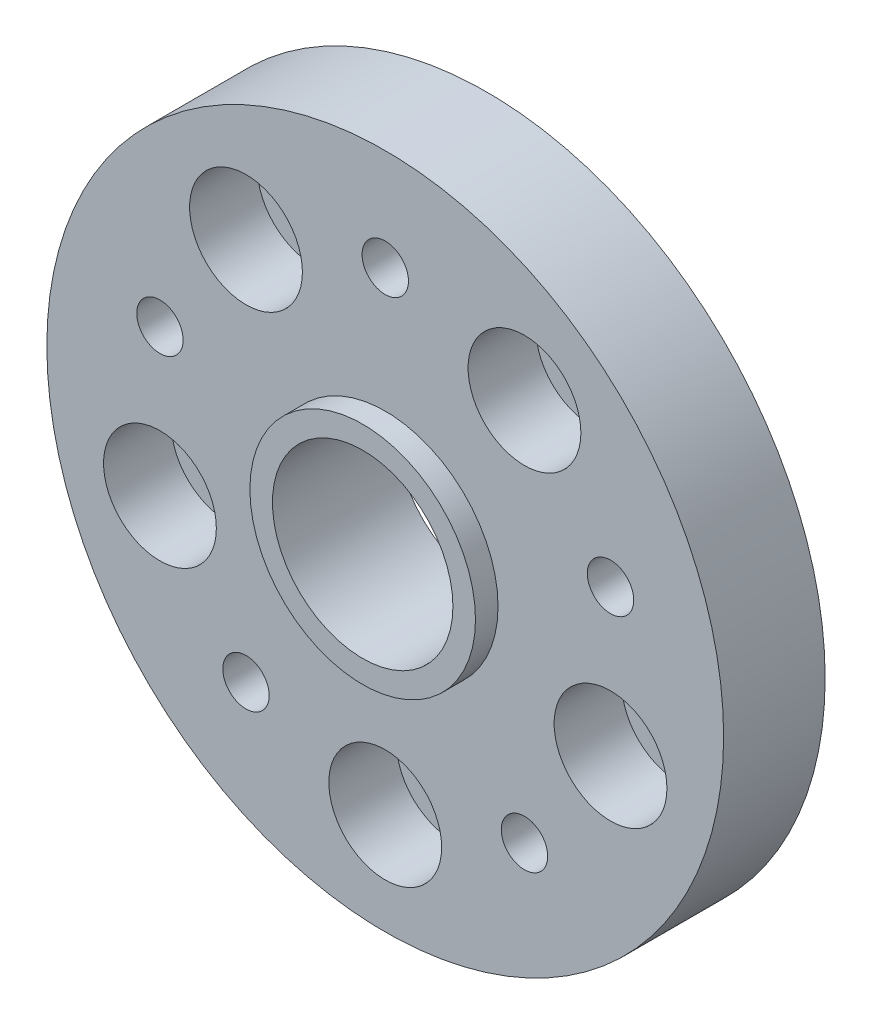
ISO-10303-21;
HEADER;
FILE_DESCRIPTION(('STEP AP214'),'2;1');
FILE_NAME('part.step','',(''),(''),'','','');
FILE_SCHEMA(('AUTOMOTIVE_DESIGN { 1 0 10303 214 1 1 1 1 }'));
ENDSEC;
DATA;
#1=APPLICATION_CONTEXT('core data for automotive mechanical design processes');
#2=APPLICATION_PROTOCOL_DEFINITION('international standard','automotive_design',2000,#1);
#3=PRODUCT_CONTEXT('',#1,'mechanical');
#4=PRODUCT('Part','Part','',(#3));
#5=PRODUCT_RELATED_PRODUCT_CATEGORY('part','',(#4));
#6=PRODUCT_DEFINITION_FORMATION('','',#4);
#7=PRODUCT_DEFINITION_CONTEXT('part definition',#1,'design');
#8=PRODUCT_DEFINITION('design','',#6,#7);
#9=PRODUCT_DEFINITION_SHAPE('','',#8);
#10=(LENGTH_UNIT() NAMED_UNIT(*) SI_UNIT(.MILLI.,.METRE.));
#11=(NAMED_UNIT(*) PLANE_ANGLE_UNIT() SI_UNIT($,.RADIAN.));
#12=(NAMED_UNIT(*) SI_UNIT($,.STERADIAN.) SOLID_ANGLE_UNIT());
#13=UNCERTAINTY_MEASURE_WITH_UNIT(LENGTH_MEASURE(1.E-05),#10,'distance_accuracy_value','');
#14=(GEOMETRIC_REPRESENTATION_CONTEXT(3) GLOBAL_UNCERTAINTY_ASSIGNED_CONTEXT((#13)) GLOBAL_UNIT_ASSIGNED_CONTEXT((#10,
#11,#12)) REPRESENTATION_CONTEXT('',''));
#15=CARTESIAN_POINT('',(0.,0.,0.));
#16=DIRECTION('',(0.,0.,1.));
#17=DIRECTION('',(1.,0.,0.));
#18=AXIS2_PLACEMENT_3D('',#15,#16,#17);
#19=CARTESIAN_POINT('',(0.,0.,14.2875));
#20=DIRECTION('',(0.,0.,1.));
#21=DIRECTION('',(1.,0.,0.));
#22=AXIS2_PLACEMENT_3D('',#19,#20,#21);
#23=PLANE('',#22);
#24=CARTESIAN_POINT('',(-19.5952908483004,-26.9706040499748,14.2875));
#25=DIRECTION('',(0.,0.,1.));
#26=DIRECTION('',(1.,0.,0.));
#27=AXIS2_PLACEMENT_3D('',#24,#25,#26);
#28=CIRCLE('',#27,3.2639);
#29=CARTESIAN_POINT('',(-16.3313908483004,-26.9706040499748,14.2875));
#30=VERTEX_POINT('',#29);
#31=EDGE_CURVE('E132',#30,#30,#28,.T.);
#32=ORIENTED_EDGE('',*,*,#31,.F.);
#33=EDGE_LOOP('',(#32));
#34=FACE_BOUND('',#33,.T.);
#35=CARTESIAN_POINT('',(-31.7058466119896,10.3018540499749,14.2875));
#36=DIRECTION('',(0.,0.,1.));
#37=DIRECTION('',(1.,0.,0.));
#38=AXIS2_PLACEMENT_3D('',#35,#36,#37);
#39=CIRCLE('',#38,3.2639);
#40=CARTESIAN_POINT('',(-28.4419466119896,10.3018540499749,14.2875));
#41=VERTEX_POINT('',#40);
#42=EDGE_CURVE('E146',#41,#41,#39,.T.);
#43=ORIENTED_EDGE('',*,*,#42,.F.);
#44=EDGE_LOOP('',(#43));
#45=FACE_BOUND('',#44,.T.);
#46=CARTESIAN_POINT('',(2.25514051876985E-13,33.3375,14.2875));
#47=DIRECTION('',(0.,0.,1.));
#48=DIRECTION('',(1.,0.,0.));
#49=AXIS2_PLACEMENT_3D('',#46,#47,#48);
#50=CIRCLE('',#49,3.2639);
#51=CARTESIAN_POINT('',(3.26390000000022,33.3375,14.2875));
#52=VERTEX_POINT('',#51);
#53=EDGE_CURVE('E159',#52,#52,#50,.T.);
#54=ORIENTED_EDGE('',*,*,#53,.F.);
#55=EDGE_LOOP('',(#54));
#56=FACE_BOUND('',#55,.T.);
#57=CARTESIAN_POINT('',(31.7058466119898,10.3018540499745,14.2875));
#58=DIRECTION('',(0.,0.,1.));
#59=DIRECTION('',(1.,0.,0.));
#60=AXIS2_PLACEMENT_3D('',#57,#58,#59);
#61=CIRCLE('',#60,3.2639);
#62=CARTESIAN_POINT('',(34.9697466119898,10.3018540499745,14.2875));
#63=VERTEX_POINT('',#62);
#64=EDGE_CURVE('E172',#63,#63,#61,.T.);
#65=ORIENTED_EDGE('',*,*,#64,.F.);
#66=EDGE_LOOP('',(#65));
#67=FACE_BOUND('',#66,.T.);
#68=CARTESIAN_POINT('',(19.5952908483,-26.9706040499751,14.2875));
#69=DIRECTION('',(0.,0.,1.));
#70=DIRECTION('',(1.,0.,0.));
#71=AXIS2_PLACEMENT_3D('',#68,#69,#70);
#72=CIRCLE('',#71,3.2639);
#73=CARTESIAN_POINT('',(22.8591908483,-26.9706040499751,14.2875));
#74=VERTEX_POINT('',#73);
#75=EDGE_CURVE('E185',#74,#74,#72,.T.);
#76=ORIENTED_EDGE('',*,*,#75,.F.);
#77=EDGE_LOOP('',(#76));
#78=FACE_BOUND('',#77,.T.);
#79=CARTESIAN_POINT('',(0.,-33.3375,14.2875));
#80=DIRECTION('',(0.,0.,1.));
#81=DIRECTION('',(1.,0.,0.));
#82=AXIS2_PLACEMENT_3D('',#79,#80,#81);
#83=CIRCLE('',#82,7.9375);
#84=CARTESIAN_POINT('',(7.9375,-33.3375,14.2875));
#85=VERTEX_POINT('',#84);
#86=EDGE_CURVE('E470',#85,#85,#83,.T.);
#87=ORIENTED_EDGE('',*,*,#86,.F.);
#88=EDGE_LOOP('',(#87));
#89=FACE_BOUND('',#88,.T.);
#90=CARTESIAN_POINT('',(-31.7058466119897,-10.3018540499747,14.2875));
#91=DIRECTION('',(0.,0.,1.));
#92=DIRECTION('',(1.,0.,0.));
#93=AXIS2_PLACEMENT_3D('',#90,#91,#92);
#94=CIRCLE('',#93,7.9375);
#95=CARTESIAN_POINT('',(-23.7683466119897,-10.3018540499747,14.2875));
#96=VERTEX_POINT('',#95);
#97=EDGE_CURVE('E448',#96,#96,#94,.T.);
#98=ORIENTED_EDGE('',*,*,#97,.F.);
#99=EDGE_LOOP('',(#98));
#100=FACE_BOUND('',#99,.T.);
#101=CARTESIAN_POINT('',(-19.5952908483002,26.9706040499749,14.2875));
#102=DIRECTION('',(0.,0.,1.));
#103=DIRECTION('',(1.,0.,0.));
#104=AXIS2_PLACEMENT_3D('',#101,#102,#103);
#105=CIRCLE('',#104,7.9375);
#106=CARTESIAN_POINT('',(-11.6577908483002,26.9706040499749,14.2875));
#107=VERTEX_POINT('',#106);
#108=EDGE_CURVE('E426',#107,#107,#105,.T.);
#109=ORIENTED_EDGE('',*,*,#108,.F.);
#110=EDGE_LOOP('',(#109));
#111=FACE_BOUND('',#110,.T.);
#112=CARTESIAN_POINT('',(19.5952908483006,26.9706040499746,14.2875));
#113=DIRECTION('',(0.,0.,1.));
#114=DIRECTION('',(1.,0.,0.));
#115=AXIS2_PLACEMENT_3D('',#112,#113,#114);
#116=CIRCLE('',#115,7.9375);
#117=CARTESIAN_POINT('',(27.5327908483006,26.9706040499746,14.2875));
#118=VERTEX_POINT('',#117);
#119=EDGE_CURVE('E404',#118,#118,#116,.T.);
#120=ORIENTED_EDGE('',*,*,#119,.F.);
#121=EDGE_LOOP('',(#120));
#122=FACE_BOUND('',#121,.T.);
#123=CARTESIAN_POINT('',(31.7058466119896,-10.3018540499752,14.2875));
#124=DIRECTION('',(0.,0.,1.));
#125=DIRECTION('',(1.,0.,0.));
#126=AXIS2_PLACEMENT_3D('',#123,#124,#125);
#127=CIRCLE('',#126,7.9375);
#128=CARTESIAN_POINT('',(39.6433466119896,-10.3018540499752,14.2875));
#129=VERTEX_POINT('',#128);
#130=EDGE_CURVE('E379',#129,#129,#127,.T.);
#131=ORIENTED_EDGE('',*,*,#130,.F.);
#132=EDGE_LOOP('',(#131));
#133=FACE_BOUND('',#132,.T.);
#134=CARTESIAN_POINT('',(0.,0.,14.2875));
#135=DIRECTION('',(0.,0.,1.));
#136=DIRECTION('',(1.,0.,0.));
#137=AXIS2_PLACEMENT_3D('',#134,#135,#136);
#138=CIRCLE('',#137,47.625);
#139=CARTESIAN_POINT('',(47.625,0.,14.2875));
#140=VERTEX_POINT('',#139);
#141=EDGE_CURVE('E11',#140,#140,#138,.T.);
#142=ORIENTED_EDGE('',*,*,#141,.T.);
#143=EDGE_LOOP('',(#142));
#144=FACE_BOUND('',#143,.T.);
#145=CARTESIAN_POINT('',(0.,0.,14.2875));
#146=DIRECTION('',(0.,0.,1.));
#147=DIRECTION('',(1.,0.,0.));
#148=AXIS2_PLACEMENT_3D('',#145,#146,#147);
#149=CIRCLE('',#148,15.875);
#150=CARTESIAN_POINT('',(15.875,0.,14.2875));
#151=VERTEX_POINT('',#150);
#152=EDGE_CURVE('E205',#151,#151,#149,.T.);
#153=ORIENTED_EDGE('',*,*,#152,.F.);
#154=EDGE_LOOP('',(#153));
#155=FACE_BOUND('',#154,.T.);
#156=ADVANCED_FACE('F40',(#34,#45,#56,#67,#78,#89,#100,#111,#122,#133,#144,#155),#23,.T.);
#157=CARTESIAN_POINT('',(0.,0.,14.2875));
#158=DIRECTION('',(0.,0.,-1.));
#159=DIRECTION('',(-1.,0.,0.));
#160=AXIS2_PLACEMENT_3D('',#157,#158,#159);
#161=CYLINDRICAL_SURFACE('',#160,47.625);
#162=ORIENTED_EDGE('',*,*,#141,.F.);
#163=EDGE_LOOP('',(#162));
#164=FACE_BOUND('',#163,.T.);
#165=CARTESIAN_POINT('',(0.,0.,0.));
#166=DIRECTION('',(0.,0.,1.));
#167=DIRECTION('',(1.,0.,0.));
#168=AXIS2_PLACEMENT_3D('',#165,#166,#167);
#169=CIRCLE('',#168,47.625);
#170=CARTESIAN_POINT('',(47.625,0.,0.));
#171=VERTEX_POINT('',#170);
#172=EDGE_CURVE('E44',#171,#171,#169,.T.);
#173=ORIENTED_EDGE('',*,*,#172,.T.);
#174=EDGE_LOOP('',(#173));
#175=FACE_BOUND('',#174,.T.);
#176=ADVANCED_FACE('F42',(#164,#175),#161,.T.);
#177=CARTESIAN_POINT('',(0.,0.,0.));
#178=DIRECTION('',(0.,0.,1.));
#179=DIRECTION('',(1.,0.,0.));
#180=AXIS2_PLACEMENT_3D('',#177,#178,#179);
#181=PLANE('',#180);
#182=CARTESIAN_POINT('',(-19.5952908483004,-26.9706040499748,0.));
#183=DIRECTION('',(0.,0.,1.));
#184=DIRECTION('',(1.,0.,0.));
#185=AXIS2_PLACEMENT_3D('',#182,#183,#184);
#186=CIRCLE('',#185,3.2639);
#187=CARTESIAN_POINT('',(-16.3313908483004,-26.9706040499748,0.));
#188=VERTEX_POINT('',#187);
#189=EDGE_CURVE('E136',#188,#188,#186,.T.);
#190=ORIENTED_EDGE('',*,*,#189,.T.);
#191=EDGE_LOOP('',(#190));
#192=FACE_BOUND('',#191,.T.);
#193=CARTESIAN_POINT('',(-31.7058466119896,10.3018540499749,0.));
#194=DIRECTION('',(0.,0.,1.));
#195=DIRECTION('',(1.,0.,0.));
#196=AXIS2_PLACEMENT_3D('',#193,#194,#195);
#197=CIRCLE('',#196,3.2639);
#198=CARTESIAN_POINT('',(-28.4419466119896,10.3018540499749,0.));
#199=VERTEX_POINT('',#198);
#200=EDGE_CURVE('E150',#199,#199,#197,.T.);
#201=ORIENTED_EDGE('',*,*,#200,.T.);
#202=EDGE_LOOP('',(#201));
#203=FACE_BOUND('',#202,.T.);
#204=CARTESIAN_POINT('',(2.25514051876985E-13,33.3375,0.));
#205=DIRECTION('',(0.,0.,1.));
#206=DIRECTION('',(1.,0.,0.));
#207=AXIS2_PLACEMENT_3D('',#204,#205,#206);
#208=CIRCLE('',#207,3.2639);
#209=CARTESIAN_POINT('',(3.26390000000022,33.3375,0.));
#210=VERTEX_POINT('',#209);
#211=EDGE_CURVE('E163',#210,#210,#208,.T.);
#212=ORIENTED_EDGE('',*,*,#211,.T.);
#213=EDGE_LOOP('',(#212));
#214=FACE_BOUND('',#213,.T.);
#215=CARTESIAN_POINT('',(31.7058466119898,10.3018540499745,0.));
#216=DIRECTION('',(0.,0.,1.));
#217=DIRECTION('',(1.,0.,0.));
#218=AXIS2_PLACEMENT_3D('',#215,#216,#217);
#219=CIRCLE('',#218,3.2639);
#220=CARTESIAN_POINT('',(34.9697466119898,10.3018540499745,0.));
#221=VERTEX_POINT('',#220);
#222=EDGE_CURVE('E176',#221,#221,#219,.T.);
#223=ORIENTED_EDGE('',*,*,#222,.T.);
#224=EDGE_LOOP('',(#223));
#225=FACE_BOUND('',#224,.T.);
#226=CARTESIAN_POINT('',(19.5952908483,-26.9706040499751,0.));
#227=DIRECTION('',(0.,0.,1.));
#228=DIRECTION('',(1.,0.,0.));
#229=AXIS2_PLACEMENT_3D('',#226,#227,#228);
#230=CIRCLE('',#229,3.2639);
#231=CARTESIAN_POINT('',(22.8591908483,-26.9706040499751,0.));
#232=VERTEX_POINT('',#231);
#233=EDGE_CURVE('E189',#232,#232,#230,.T.);
#234=ORIENTED_EDGE('',*,*,#233,.T.);
#235=EDGE_LOOP('',(#234));
#236=FACE_BOUND('',#235,.T.);
#237=CARTESIAN_POINT('',(0.,-33.3375,0.));
#238=DIRECTION('',(0.,0.,1.));
#239=DIRECTION('',(1.,0.,0.));
#240=AXIS2_PLACEMENT_3D('',#237,#238,#239);
#241=CIRCLE('',#240,5.0419);
#242=CARTESIAN_POINT('',(5.0419,-33.3375,0.));
#243=VERTEX_POINT('',#242);
#244=EDGE_CURVE('E255',#243,#243,#241,.T.);
#245=ORIENTED_EDGE('',*,*,#244,.T.);
#246=EDGE_LOOP('',(#245));
#247=FACE_BOUND('',#246,.T.);
#248=CARTESIAN_POINT('',(-31.7058466119897,-10.3018540499747,0.));
#249=DIRECTION('',(0.,0.,1.));
#250=DIRECTION('',(1.,0.,0.));
#251=AXIS2_PLACEMENT_3D('',#248,#249,#250);
#252=CIRCLE('',#251,5.04189999999999);
#253=CARTESIAN_POINT('',(-26.6639466119897,-10.3018540499747,0.));
#254=VERTEX_POINT('',#253);
#255=EDGE_CURVE('E222',#254,#254,#252,.T.);
#256=ORIENTED_EDGE('',*,*,#255,.T.);
#257=EDGE_LOOP('',(#256));
#258=FACE_BOUND('',#257,.T.);
#259=CARTESIAN_POINT('',(-19.5952908483002,26.9706040499749,0.));
#260=DIRECTION('',(0.,0.,1.));
#261=DIRECTION('',(1.,0.,0.));
#262=AXIS2_PLACEMENT_3D('',#259,#260,#261);
#263=CIRCLE('',#262,5.0419);
#264=CARTESIAN_POINT('',(-14.5533908483002,26.9706040499749,0.));
#265=VERTEX_POINT('',#264);
#266=EDGE_CURVE('E239',#265,#265,#263,.T.);
#267=ORIENTED_EDGE('',*,*,#266,.T.);
#268=EDGE_LOOP('',(#267));
#269=FACE_BOUND('',#268,.T.);
#270=CARTESIAN_POINT('',(19.5952908483006,26.9706040499746,0.));
#271=DIRECTION('',(0.,0.,1.));
#272=DIRECTION('',(1.,0.,0.));
#273=AXIS2_PLACEMENT_3D('',#270,#271,#272);
#274=CIRCLE('',#273,5.04189999999999);
#275=CARTESIAN_POINT('',(24.6371908483006,26.9706040499746,0.));
#276=VERTEX_POINT('',#275);
#277=EDGE_CURVE('E269',#276,#276,#274,.T.);
#278=ORIENTED_EDGE('',*,*,#277,.T.);
#279=EDGE_LOOP('',(#278));
#280=FACE_BOUND('',#279,.T.);
#281=CARTESIAN_POINT('',(31.7058466119896,-10.3018540499752,0.));
#282=DIRECTION('',(0.,0.,1.));
#283=DIRECTION('',(1.,0.,0.));
#284=AXIS2_PLACEMENT_3D('',#281,#282,#283);
#285=CIRCLE('',#284,5.04189999999999);
#286=CARTESIAN_POINT('',(36.7477466119896,-10.3018540499752,0.));
#287=VERTEX_POINT('',#286);
#288=EDGE_CURVE('E206',#287,#287,#285,.T.);
#289=ORIENTED_EDGE('',*,*,#288,.T.);
#290=EDGE_LOOP('',(#289));
#291=FACE_BOUND('',#290,.T.);
#292=CARTESIAN_POINT('',(0.,0.,0.));
#293=DIRECTION('',(0.,0.,1.));
#294=DIRECTION('',(1.,0.,0.));
#295=AXIS2_PLACEMENT_3D('',#292,#293,#294);
#296=CIRCLE('',#295,12.7);
#297=CARTESIAN_POINT('',(12.7,0.,0.));
#298=VERTEX_POINT('',#297);
#299=EDGE_CURVE('E55',#298,#298,#296,.T.);
#300=ORIENTED_EDGE('',*,*,#299,.T.);
#301=EDGE_LOOP('',(#300));
#302=FACE_BOUND('',#301,.T.);
#303=ORIENTED_EDGE('',*,*,#172,.F.);
#304=EDGE_LOOP('',(#303));
#305=FACE_BOUND('',#304,.T.);
#306=ADVANCED_FACE('F386',(#192,#203,#214,#225,#236,#247,#258,#269,#280,#291,#302,#305),#181,.F.);
#307=CARTESIAN_POINT('',(0.,0.,0.));
#308=DIRECTION('',(0.,0.,1.));
#309=DIRECTION('',(1.,0.,0.));
#310=AXIS2_PLACEMENT_3D('',#307,#308,#309);
#311=CYLINDRICAL_SURFACE('',#310,12.7);
#312=ORIENTED_EDGE('',*,*,#299,.F.);
#313=EDGE_LOOP('',(#312));
#314=FACE_BOUND('',#313,.T.);
#315=CARTESIAN_POINT('',(0.,0.,17.4625));
#316=DIRECTION('',(0.,0.,1.));
#317=DIRECTION('',(1.,0.,0.));
#318=AXIS2_PLACEMENT_3D('',#315,#316,#317);
#319=CIRCLE('',#318,12.7);
#320=CARTESIAN_POINT('',(12.7,0.,17.4625));
#321=VERTEX_POINT('',#320);
#322=EDGE_CURVE('E199',#321,#321,#319,.T.);
#323=ORIENTED_EDGE('',*,*,#322,.T.);
#324=EDGE_LOOP('',(#323));
#325=FACE_BOUND('',#324,.T.);
#326=ADVANCED_FACE('F505',(#314,#325),#311,.F.);
#327=CARTESIAN_POINT('',(0.,0.,17.4625));
#328=DIRECTION('',(0.,0.,1.));
#329=DIRECTION('',(1.,0.,0.));
#330=AXIS2_PLACEMENT_3D('',#327,#328,#329);
#331=PLANE('',#330);
#332=CARTESIAN_POINT('',(0.,0.,17.4625));
#333=DIRECTION('',(0.,0.,1.));
#334=DIRECTION('',(1.,0.,0.));
#335=AXIS2_PLACEMENT_3D('',#332,#333,#334);
#336=CIRCLE('',#335,15.875);
#337=CARTESIAN_POINT('',(15.875,0.,17.4625));
#338=VERTEX_POINT('',#337);
#339=EDGE_CURVE('E208',#338,#338,#336,.T.);
#340=ORIENTED_EDGE('',*,*,#339,.T.);
#341=EDGE_LOOP('',(#340));
#342=FACE_BOUND('',#341,.T.);
#343=ORIENTED_EDGE('',*,*,#322,.F.);
#344=EDGE_LOOP('',(#343));
#345=FACE_BOUND('',#344,.T.);
#346=ADVANCED_FACE('F508',(#342,#345),#331,.T.);
#347=CARTESIAN_POINT('',(0.,0.,17.4625));
#348=DIRECTION('',(0.,0.,-1.));
#349=DIRECTION('',(-1.,0.,0.));
#350=AXIS2_PLACEMENT_3D('',#347,#348,#349);
#351=CYLINDRICAL_SURFACE('',#350,15.875);
#352=ORIENTED_EDGE('',*,*,#339,.F.);
#353=EDGE_LOOP('',(#352));
#354=FACE_BOUND('',#353,.T.);
#355=ORIENTED_EDGE('',*,*,#152,.T.);
#356=EDGE_LOOP('',(#355));
#357=FACE_BOUND('',#356,.T.);
#358=ADVANCED_FACE('F513',(#354,#357),#351,.T.);
#359=CARTESIAN_POINT('',(31.7058466119896,-10.3018540499752,14.2875));
#360=DIRECTION('',(0.,0.,1.));
#361=DIRECTION('',(1.,0.,0.));
#362=AXIS2_PLACEMENT_3D('',#359,#360,#361);
#363=CYLINDRICAL_SURFACE('',#362,5.0419);
#364=ORIENTED_EDGE('',*,*,#288,.F.);
#365=EDGE_LOOP('',(#364));
#366=FACE_BOUND('',#365,.T.);
#367=CARTESIAN_POINT('',(31.7058466119896,-10.3018540499752,4.7625));
#368=DIRECTION('',(0.,0.,1.));
#369=DIRECTION('',(1.,0.,0.));
#370=AXIS2_PLACEMENT_3D('',#367,#368,#369);
#371=CIRCLE('',#370,5.0419);
#372=CARTESIAN_POINT('',(36.7477466119896,-10.3018540499752,4.7625));
#373=VERTEX_POINT('',#372);
#374=EDGE_CURVE('E276',#373,#373,#371,.T.);
#375=ORIENTED_EDGE('',*,*,#374,.T.);
#376=EDGE_LOOP('',(#375));
#377=FACE_BOUND('',#376,.T.);
#378=ADVANCED_FACE('F518',(#366,#377),#363,.F.);
#379=CARTESIAN_POINT('',(36.7477466119896,-10.3018540499752,4.7625));
#380=DIRECTION('',(0.,0.,-1.));
#381=DIRECTION('',(-1.,0.,0.));
#382=AXIS2_PLACEMENT_3D('',#379,#380,#381);
#383=PLANE('',#382);
#384=ORIENTED_EDGE('',*,*,#374,.F.);
#385=EDGE_LOOP('',(#384));
#386=FACE_BOUND('',#385,.T.);
#387=CARTESIAN_POINT('',(31.7058466119896,-10.3018540499752,4.7625));
#388=DIRECTION('',(0.,0.,1.));
#389=DIRECTION('',(1.,0.,0.));
#390=AXIS2_PLACEMENT_3D('',#387,#388,#389);
#391=CIRCLE('',#390,7.9375);
#392=CARTESIAN_POINT('',(39.6433466119896,-10.3018540499752,4.7625));
#393=VERTEX_POINT('',#392);
#394=EDGE_CURVE('E280',#393,#393,#391,.T.);
#395=ORIENTED_EDGE('',*,*,#394,.T.);
#396=EDGE_LOOP('',(#395));
#397=FACE_BOUND('',#396,.T.);
#398=ADVANCED_FACE('F564',(#386,#397),#383,.F.);
#399=CARTESIAN_POINT('',(31.7058466119896,-10.3018540499752,14.2875));
#400=DIRECTION('',(0.,0.,1.));
#401=DIRECTION('',(1.,0.,0.));
#402=AXIS2_PLACEMENT_3D('',#399,#400,#401);
#403=CYLINDRICAL_SURFACE('',#402,7.9375);
#404=ORIENTED_EDGE('',*,*,#394,.F.);
#405=EDGE_LOOP('',(#404));
#406=FACE_BOUND('',#405,.T.);
#407=ORIENTED_EDGE('',*,*,#130,.T.);
#408=EDGE_LOOP('',(#407));
#409=FACE_BOUND('',#408,.T.);
#410=ADVANCED_FACE('F393',(#406,#409),#403,.F.);
#411=CARTESIAN_POINT('',(19.5952908483006,26.9706040499746,14.2875));
#412=DIRECTION('',(0.,0.,1.));
#413=DIRECTION('',(1.,0.,0.));
#414=AXIS2_PLACEMENT_3D('',#411,#412,#413);
#415=CYLINDRICAL_SURFACE('',#414,5.0419);
#416=ORIENTED_EDGE('',*,*,#277,.F.);
#417=EDGE_LOOP('',(#416));
#418=FACE_BOUND('',#417,.T.);
#419=CARTESIAN_POINT('',(19.5952908483006,26.9706040499746,4.7625));
#420=DIRECTION('',(0.,0.,1.));
#421=DIRECTION('',(1.,0.,0.));
#422=AXIS2_PLACEMENT_3D('',#419,#420,#421);
#423=CIRCLE('',#422,5.0419);
#424=CARTESIAN_POINT('',(24.6371908483006,26.9706040499746,4.7625));
#425=VERTEX_POINT('',#424);
#426=EDGE_CURVE('E264',#425,#425,#423,.T.);
#427=ORIENTED_EDGE('',*,*,#426,.T.);
#428=EDGE_LOOP('',(#427));
#429=FACE_BOUND('',#428,.T.);
#430=ADVANCED_FACE('F389',(#418,#429),#415,.F.);
#431=CARTESIAN_POINT('',(24.6371908483006,26.9706040499746,4.7625));
#432=DIRECTION('',(0.,0.,-1.));
#433=DIRECTION('',(-1.,0.,0.));
#434=AXIS2_PLACEMENT_3D('',#431,#432,#433);
#435=PLANE('',#434);
#436=ORIENTED_EDGE('',*,*,#426,.F.);
#437=EDGE_LOOP('',(#436));
#438=FACE_BOUND('',#437,.T.);
#439=CARTESIAN_POINT('',(19.5952908483006,26.9706040499746,4.7625));
#440=DIRECTION('',(0.,0.,1.));
#441=DIRECTION('',(1.,0.,0.));
#442=AXIS2_PLACEMENT_3D('',#439,#440,#441);
#443=CIRCLE('',#442,7.9375);
#444=CARTESIAN_POINT('',(27.5327908483006,26.9706040499746,4.7625));
#445=VERTEX_POINT('',#444);
#446=EDGE_CURVE('E270',#445,#445,#443,.T.);
#447=ORIENTED_EDGE('',*,*,#446,.T.);
#448=EDGE_LOOP('',(#447));
#449=FACE_BOUND('',#448,.T.);
#450=ADVANCED_FACE('F392',(#438,#449),#435,.F.);
#451=CARTESIAN_POINT('',(19.5952908483006,26.9706040499746,14.2875));
#452=DIRECTION('',(0.,0.,1.));
#453=DIRECTION('',(1.,0.,0.));
#454=AXIS2_PLACEMENT_3D('',#451,#452,#453);
#455=CYLINDRICAL_SURFACE('',#454,7.9375);
#456=ORIENTED_EDGE('',*,*,#446,.F.);
#457=EDGE_LOOP('',(#456));
#458=FACE_BOUND('',#457,.T.);
#459=ORIENTED_EDGE('',*,*,#119,.T.);
#460=EDGE_LOOP('',(#459));
#461=FACE_BOUND('',#460,.T.);
#462=ADVANCED_FACE('F399',(#458,#461),#455,.F.);
#463=CARTESIAN_POINT('',(-19.5952908483002,26.9706040499749,14.2875));
#464=DIRECTION('',(0.,0.,1.));
#465=DIRECTION('',(1.,0.,0.));
#466=AXIS2_PLACEMENT_3D('',#463,#464,#465);
#467=CYLINDRICAL_SURFACE('',#466,5.0419);
#468=ORIENTED_EDGE('',*,*,#266,.F.);
#469=EDGE_LOOP('',(#468));
#470=FACE_BOUND('',#469,.T.);
#471=CARTESIAN_POINT('',(-19.5952908483002,26.9706040499749,4.7625));
#472=DIRECTION('',(0.,0.,1.));
#473=DIRECTION('',(1.,0.,0.));
#474=AXIS2_PLACEMENT_3D('',#471,#472,#473);
#475=CIRCLE('',#474,5.0419);
#476=CARTESIAN_POINT('',(-14.5533908483002,26.9706040499749,4.7625));
#477=VERTEX_POINT('',#476);
#478=EDGE_CURVE('E234',#477,#477,#475,.T.);
#479=ORIENTED_EDGE('',*,*,#478,.T.);
#480=EDGE_LOOP('',(#479));
#481=FACE_BOUND('',#480,.T.);
#482=ADVANCED_FACE('F412',(#470,#481),#467,.F.);
#483=CARTESIAN_POINT('',(-14.5533908483002,26.9706040499749,4.7625));
#484=DIRECTION('',(0.,0.,-1.));
#485=DIRECTION('',(-1.,0.,0.));
#486=AXIS2_PLACEMENT_3D('',#483,#484,#485);
#487=PLANE('',#486);
#488=ORIENTED_EDGE('',*,*,#478,.F.);
#489=EDGE_LOOP('',(#488));
#490=FACE_BOUND('',#489,.T.);
#491=CARTESIAN_POINT('',(-19.5952908483002,26.9706040499749,4.7625));
#492=DIRECTION('',(0.,0.,1.));
#493=DIRECTION('',(1.,0.,0.));
#494=AXIS2_PLACEMENT_3D('',#491,#492,#493);
#495=CIRCLE('',#494,7.9375);
#496=CARTESIAN_POINT('',(-11.6577908483002,26.9706040499749,4.7625));
#497=VERTEX_POINT('',#496);
#498=EDGE_CURVE('E240',#497,#497,#495,.T.);
#499=ORIENTED_EDGE('',*,*,#498,.T.);
#500=EDGE_LOOP('',(#499));
#501=FACE_BOUND('',#500,.T.);
#502=ADVANCED_FACE('F415',(#490,#501),#487,.F.);
#503=CARTESIAN_POINT('',(-19.5952908483002,26.9706040499749,14.2875));
#504=DIRECTION('',(0.,0.,1.));
#505=DIRECTION('',(1.,0.,0.));
#506=AXIS2_PLACEMENT_3D('',#503,#504,#505);
#507=CYLINDRICAL_SURFACE('',#506,7.9375);
#508=ORIENTED_EDGE('',*,*,#498,.F.);
#509=EDGE_LOOP('',(#508));
#510=FACE_BOUND('',#509,.T.);
#511=ORIENTED_EDGE('',*,*,#108,.T.);
#512=EDGE_LOOP('',(#511));
#513=FACE_BOUND('',#512,.T.);
#514=ADVANCED_FACE('F421',(#510,#513),#507,.F.);
#515=CARTESIAN_POINT('',(-31.7058466119897,-10.3018540499747,14.2875));
#516=DIRECTION('',(0.,0.,1.));
#517=DIRECTION('',(1.,0.,0.));
#518=AXIS2_PLACEMENT_3D('',#515,#516,#517);
#519=CYLINDRICAL_SURFACE('',#518,5.0419);
#520=ORIENTED_EDGE('',*,*,#255,.F.);
#521=EDGE_LOOP('',(#520));
#522=FACE_BOUND('',#521,.T.);
#523=CARTESIAN_POINT('',(-31.7058466119897,-10.3018540499747,4.7625));
#524=DIRECTION('',(0.,0.,1.));
#525=DIRECTION('',(1.,0.,0.));
#526=AXIS2_PLACEMENT_3D('',#523,#524,#525);
#527=CIRCLE('',#526,5.0419);
#528=CARTESIAN_POINT('',(-26.6639466119897,-10.3018540499747,4.7625));
#529=VERTEX_POINT('',#528);
#530=EDGE_CURVE('E217',#529,#529,#527,.T.);
#531=ORIENTED_EDGE('',*,*,#530,.T.);
#532=EDGE_LOOP('',(#531));
#533=FACE_BOUND('',#532,.T.);
#534=ADVANCED_FACE('F434',(#522,#533),#519,.F.);
#535=CARTESIAN_POINT('',(-26.6639466119897,-10.3018540499747,4.7625));
#536=DIRECTION('',(0.,0.,-1.));
#537=DIRECTION('',(-1.,0.,0.));
#538=AXIS2_PLACEMENT_3D('',#535,#536,#537);
#539=PLANE('',#538);
#540=ORIENTED_EDGE('',*,*,#530,.F.);
#541=EDGE_LOOP('',(#540));
#542=FACE_BOUND('',#541,.T.);
#543=CARTESIAN_POINT('',(-31.7058466119897,-10.3018540499747,4.7625));
#544=DIRECTION('',(0.,0.,1.));
#545=DIRECTION('',(1.,0.,0.));
#546=AXIS2_PLACEMENT_3D('',#543,#544,#545);
#547=CIRCLE('',#546,7.9375);
#548=CARTESIAN_POINT('',(-23.7683466119897,-10.3018540499747,4.7625));
#549=VERTEX_POINT('',#548);
#550=EDGE_CURVE('E223',#549,#549,#547,.T.);
#551=ORIENTED_EDGE('',*,*,#550,.T.);
#552=EDGE_LOOP('',(#551));
#553=FACE_BOUND('',#552,.T.);
#554=ADVANCED_FACE('F437',(#542,#553),#539,.F.);
#555=CARTESIAN_POINT('',(-31.7058466119897,-10.3018540499747,14.2875));
#556=DIRECTION('',(0.,0.,1.));
#557=DIRECTION('',(1.,0.,0.));
#558=AXIS2_PLACEMENT_3D('',#555,#556,#557);
#559=CYLINDRICAL_SURFACE('',#558,7.9375);
#560=ORIENTED_EDGE('',*,*,#550,.F.);
#561=EDGE_LOOP('',(#560));
#562=FACE_BOUND('',#561,.T.);
#563=ORIENTED_EDGE('',*,*,#97,.T.);
#564=EDGE_LOOP('',(#563));
#565=FACE_BOUND('',#564,.T.);
#566=ADVANCED_FACE('F443',(#562,#565),#559,.F.);
#567=CARTESIAN_POINT('',(0.,-33.3375,14.2875));
#568=DIRECTION('',(0.,0.,1.));
#569=DIRECTION('',(1.,0.,0.));
#570=AXIS2_PLACEMENT_3D('',#567,#568,#569);
#571=CYLINDRICAL_SURFACE('',#570,5.0419);
#572=ORIENTED_EDGE('',*,*,#244,.F.);
#573=EDGE_LOOP('',(#572));
#574=FACE_BOUND('',#573,.T.);
#575=CARTESIAN_POINT('',(0.,-33.3375,4.7625));
#576=DIRECTION('',(0.,0.,1.));
#577=DIRECTION('',(1.,0.,0.));
#578=AXIS2_PLACEMENT_3D('',#575,#576,#577);
#579=CIRCLE('',#578,5.0419);
#580=CARTESIAN_POINT('',(5.0419,-33.3375,4.7625));
#581=VERTEX_POINT('',#580);
#582=EDGE_CURVE('E250',#581,#581,#579,.T.);
#583=ORIENTED_EDGE('',*,*,#582,.T.);
#584=EDGE_LOOP('',(#583));
#585=FACE_BOUND('',#584,.T.);
#586=ADVANCED_FACE('F456',(#574,#585),#571,.F.);
#587=CARTESIAN_POINT('',(5.0419,-33.3375,4.7625));
#588=DIRECTION('',(0.,0.,-1.));
#589=DIRECTION('',(-1.,0.,0.));
#590=AXIS2_PLACEMENT_3D('',#587,#588,#589);
#591=PLANE('',#590);
#592=ORIENTED_EDGE('',*,*,#582,.F.);
#593=EDGE_LOOP('',(#592));
#594=FACE_BOUND('',#593,.T.);
#595=CARTESIAN_POINT('',(0.,-33.3375,4.7625));
#596=DIRECTION('',(0.,0.,1.));
#597=DIRECTION('',(1.,0.,0.));
#598=AXIS2_PLACEMENT_3D('',#595,#596,#597);
#599=CIRCLE('',#598,7.9375);
#600=CARTESIAN_POINT('',(7.9375,-33.3375,4.7625));
#601=VERTEX_POINT('',#600);
#602=EDGE_CURVE('E256',#601,#601,#599,.T.);
#603=ORIENTED_EDGE('',*,*,#602,.T.);
#604=EDGE_LOOP('',(#603));
#605=FACE_BOUND('',#604,.T.);
#606=ADVANCED_FACE('F459',(#594,#605),#591,.F.);
#607=CARTESIAN_POINT('',(0.,-33.3375,14.2875));
#608=DIRECTION('',(0.,0.,1.));
#609=DIRECTION('',(1.,0.,0.));
#610=AXIS2_PLACEMENT_3D('',#607,#608,#609);
#611=CYLINDRICAL_SURFACE('',#610,7.9375);
#612=ORIENTED_EDGE('',*,*,#602,.F.);
#613=EDGE_LOOP('',(#612));
#614=FACE_BOUND('',#613,.T.);
#615=ORIENTED_EDGE('',*,*,#86,.T.);
#616=EDGE_LOOP('',(#615));
#617=FACE_BOUND('',#616,.T.);
#618=ADVANCED_FACE('F465',(#614,#617),#611,.F.);
#619=CARTESIAN_POINT('',(19.5952908483,-26.9706040499751,14.2875));
#620=DIRECTION('',(0.,0.,1.));
#621=DIRECTION('',(1.,0.,0.));
#622=AXIS2_PLACEMENT_3D('',#619,#620,#621);
#623=CYLINDRICAL_SURFACE('',#622,3.2639);
#624=ORIENTED_EDGE('',*,*,#233,.F.);
#625=EDGE_LOOP('',(#624));
#626=FACE_BOUND('',#625,.T.);
#627=ORIENTED_EDGE('',*,*,#75,.T.);
#628=EDGE_LOOP('',(#627));
#629=FACE_BOUND('',#628,.T.);
#630=ADVANCED_FACE('F478',(#626,#629),#623,.F.);
#631=CARTESIAN_POINT('',(31.7058466119898,10.3018540499745,14.2875));
#632=DIRECTION('',(0.,0.,1.));
#633=DIRECTION('',(1.,0.,0.));
#634=AXIS2_PLACEMENT_3D('',#631,#632,#633);
#635=CYLINDRICAL_SURFACE('',#634,3.2639);
#636=ORIENTED_EDGE('',*,*,#222,.F.);
#637=EDGE_LOOP('',(#636));
#638=FACE_BOUND('',#637,.T.);
#639=ORIENTED_EDGE('',*,*,#64,.T.);
#640=EDGE_LOOP('',(#639));
#641=FACE_BOUND('',#640,.T.);
#642=ADVANCED_FACE('F481',(#638,#641),#635,.F.);
#643=CARTESIAN_POINT('',(2.25514051876985E-13,33.3375,14.2875));
#644=DIRECTION('',(0.,0.,1.));
#645=DIRECTION('',(1.,0.,0.));
#646=AXIS2_PLACEMENT_3D('',#643,#644,#645);
#647=CYLINDRICAL_SURFACE('',#646,3.2639);
#648=ORIENTED_EDGE('',*,*,#211,.F.);
#649=EDGE_LOOP('',(#648));
#650=FACE_BOUND('',#649,.T.);
#651=ORIENTED_EDGE('',*,*,#53,.T.);
#652=EDGE_LOOP('',(#651));
#653=FACE_BOUND('',#652,.T.);
#654=ADVANCED_FACE('F543',(#650,#653),#647,.F.);
#655=CARTESIAN_POINT('',(-31.7058466119896,10.3018540499749,14.2875));
#656=DIRECTION('',(0.,0.,1.));
#657=DIRECTION('',(1.,0.,0.));
#658=AXIS2_PLACEMENT_3D('',#655,#656,#657);
#659=CYLINDRICAL_SURFACE('',#658,3.2639);
#660=ORIENTED_EDGE('',*,*,#200,.F.);
#661=EDGE_LOOP('',(#660));
#662=FACE_BOUND('',#661,.T.);
#663=ORIENTED_EDGE('',*,*,#42,.T.);
#664=EDGE_LOOP('',(#663));
#665=FACE_BOUND('',#664,.T.);
#666=ADVANCED_FACE('F550',(#662,#665),#659,.F.);
#667=CARTESIAN_POINT('',(-19.5952908483004,-26.9706040499748,14.2875));
#668=DIRECTION('',(0.,0.,1.));
#669=DIRECTION('',(1.,0.,0.));
#670=AXIS2_PLACEMENT_3D('',#667,#668,#669);
#671=CYLINDRICAL_SURFACE('',#670,3.2639);
#672=ORIENTED_EDGE('',*,*,#189,.F.);
#673=EDGE_LOOP('',(#672));
#674=FACE_BOUND('',#673,.T.);
#675=ORIENTED_EDGE('',*,*,#31,.T.);
#676=EDGE_LOOP('',(#675));
#677=FACE_BOUND('',#676,.T.);
#678=ADVANCED_FACE('F677',(#674,#677),#671,.F.);
#679=CLOSED_SHELL('',(#156,#176,#306,#326,#346,#358,#378,#398,#410,#430,#450,#462,#482,#502,
#514,#534,#554,#566,#586,#606,#618,#630,#642,#654,#666,#678));
#680=MANIFOLD_SOLID_BREP('B2',#679);
#681=ADVANCED_BREP_SHAPE_REPRESENTATION('',(#18,#680),#14);
#682=SHAPE_DEFINITION_REPRESENTATION(#9,#681);
ENDSEC;
END-ISO-10303-21;
